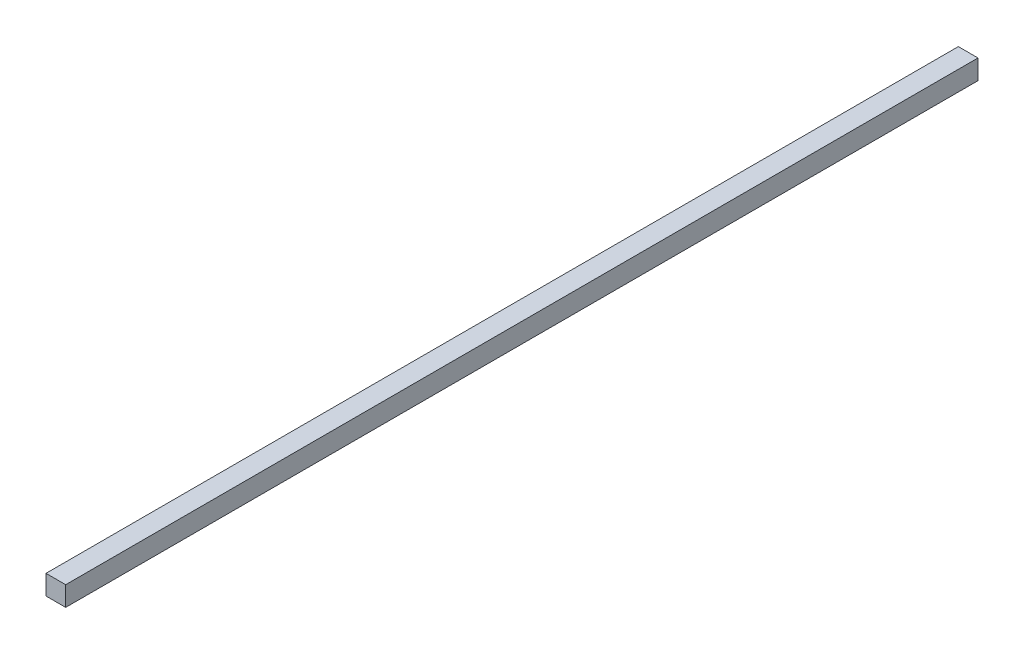
ISO-10303-21;
HEADER;
FILE_DESCRIPTION(('STEP AP214'),'2;1');
FILE_NAME('part.step','',(''),(''),'','','');
FILE_SCHEMA(('AUTOMOTIVE_DESIGN { 1 0 10303 214 1 1 1 1 }'));
ENDSEC;
DATA;
#1=APPLICATION_CONTEXT('core data for automotive mechanical design processes');
#2=APPLICATION_PROTOCOL_DEFINITION('international standard','automotive_design',2000,#1);
#3=PRODUCT_CONTEXT('',#1,'mechanical');
#4=PRODUCT('Part','Part','',(#3));
#5=PRODUCT_RELATED_PRODUCT_CATEGORY('part','',(#4));
#6=PRODUCT_DEFINITION_FORMATION('','',#4);
#7=PRODUCT_DEFINITION_CONTEXT('part definition',#1,'design');
#8=PRODUCT_DEFINITION('design','',#6,#7);
#9=PRODUCT_DEFINITION_SHAPE('','',#8);
#10=(LENGTH_UNIT() NAMED_UNIT(*) SI_UNIT(.MILLI.,.METRE.));
#11=(NAMED_UNIT(*) PLANE_ANGLE_UNIT() SI_UNIT($,.RADIAN.));
#12=(NAMED_UNIT(*) SI_UNIT($,.STERADIAN.) SOLID_ANGLE_UNIT());
#13=UNCERTAINTY_MEASURE_WITH_UNIT(LENGTH_MEASURE(1.E-05),#10,'distance_accuracy_value','');
#14=(GEOMETRIC_REPRESENTATION_CONTEXT(3) GLOBAL_UNCERTAINTY_ASSIGNED_CONTEXT((#13)) GLOBAL_UNIT_ASSIGNED_CONTEXT((#10,
#11,#12)) REPRESENTATION_CONTEXT('',''));
#15=CARTESIAN_POINT('',(0.,0.,0.));
#16=DIRECTION('',(0.,0.,1.));
#17=DIRECTION('',(1.,0.,0.));
#18=AXIS2_PLACEMENT_3D('',#15,#16,#17);
#19=CARTESIAN_POINT('',(0.,4.8,222.5));
#20=DIRECTION('',(1.,0.,0.));
#21=DIRECTION('',(0.,1.,0.));
#22=AXIS2_PLACEMENT_3D('',#19,#20,#21);
#23=PLANE('',#22);
#24=DIRECTION('',(0.,-1.,0.));
#25=VECTOR('',#24,1.);
#26=CARTESIAN_POINT('',(0.,4.8,0.));
#27=LINE('',#26,#25);
#28=CARTESIAN_POINT('',(0.,4.8,0.));
#29=VERTEX_POINT('',#28);
#30=CARTESIAN_POINT('',(0.,0.,0.));
#31=VERTEX_POINT('',#30);
#32=EDGE_CURVE('E96',#29,#31,#27,.T.);
#33=ORIENTED_EDGE('',*,*,#32,.T.);
#34=DIRECTION('',(0.,0.,-1.));
#35=VECTOR('',#34,1.);
#36=CARTESIAN_POINT('',(0.,0.,222.5));
#37=LINE('',#36,#35);
#38=CARTESIAN_POINT('',(0.,0.,222.5));
#39=VERTEX_POINT('',#38);
#40=EDGE_CURVE('E11',#39,#31,#37,.T.);
#41=ORIENTED_EDGE('',*,*,#40,.F.);
#42=DIRECTION('',(0.,-1.,0.));
#43=VECTOR('',#42,1.);
#44=CARTESIAN_POINT('',(0.,4.8,222.5));
#45=LINE('',#44,#43);
#46=CARTESIAN_POINT('',(0.,4.8,222.5));
#47=VERTEX_POINT('',#46);
#48=EDGE_CURVE('E84',#47,#39,#45,.T.);
#49=ORIENTED_EDGE('',*,*,#48,.F.);
#50=DIRECTION('',(0.,0.,-1.));
#51=VECTOR('',#50,1.);
#52=CARTESIAN_POINT('',(0.,4.8,222.5));
#53=LINE('',#52,#51);
#54=EDGE_CURVE('E92',#47,#29,#53,.T.);
#55=ORIENTED_EDGE('',*,*,#54,.T.);
#56=EDGE_LOOP('',(#33,#41,#49,#55));
#57=FACE_BOUND('',#56,.T.);
#58=ADVANCED_FACE('F33',(#57),#23,.F.);
#59=CARTESIAN_POINT('',(0.,0.,222.5));
#60=DIRECTION('',(0.,1.,0.));
#61=DIRECTION('',(0.,0.,1.));
#62=AXIS2_PLACEMENT_3D('',#59,#60,#61);
#63=PLANE('',#62);
#64=DIRECTION('',(1.,0.,0.));
#65=VECTOR('',#64,1.);
#66=CARTESIAN_POINT('',(0.,0.,0.));
#67=LINE('',#66,#65);
#68=CARTESIAN_POINT('',(4.8,0.,0.));
#69=VERTEX_POINT('',#68);
#70=EDGE_CURVE('E88',#31,#69,#67,.T.);
#71=ORIENTED_EDGE('',*,*,#70,.T.);
#72=DIRECTION('',(0.,0.,-1.));
#73=VECTOR('',#72,1.);
#74=CARTESIAN_POINT('',(4.8,0.,222.5));
#75=LINE('',#74,#73);
#76=CARTESIAN_POINT('',(4.8,0.,222.5));
#77=VERTEX_POINT('',#76);
#78=EDGE_CURVE('E41',#77,#69,#75,.T.);
#79=ORIENTED_EDGE('',*,*,#78,.F.);
#80=DIRECTION('',(1.,0.,0.));
#81=VECTOR('',#80,1.);
#82=CARTESIAN_POINT('',(0.,0.,222.5));
#83=LINE('',#82,#81);
#84=EDGE_CURVE('E79',#39,#77,#83,.T.);
#85=ORIENTED_EDGE('',*,*,#84,.F.);
#86=ORIENTED_EDGE('',*,*,#40,.T.);
#87=EDGE_LOOP('',(#71,#79,#85,#86));
#88=FACE_BOUND('',#87,.T.);
#89=ADVANCED_FACE('F87',(#88),#63,.F.);
#90=CARTESIAN_POINT('',(4.8,4.8,222.5));
#91=DIRECTION('',(-1.,0.,0.));
#92=DIRECTION('',(0.,0.,1.));
#93=AXIS2_PLACEMENT_3D('',#90,#91,#92);
#94=PLANE('',#93);
#95=DIRECTION('',(0.,1.,0.));
#96=VECTOR('',#95,1.);
#97=CARTESIAN_POINT('',(4.8,4.8,0.));
#98=LINE('',#97,#96);
#99=CARTESIAN_POINT('',(4.8,4.8,0.));
#100=VERTEX_POINT('',#99);
#101=EDGE_CURVE('E66',#69,#100,#98,.T.);
#102=ORIENTED_EDGE('',*,*,#101,.T.);
#103=DIRECTION('',(0.,0.,-1.));
#104=VECTOR('',#103,1.);
#105=CARTESIAN_POINT('',(4.8,4.8,222.5));
#106=LINE('',#105,#104);
#107=CARTESIAN_POINT('',(4.8,4.8,222.5));
#108=VERTEX_POINT('',#107);
#109=EDGE_CURVE('E89',#108,#100,#106,.T.);
#110=ORIENTED_EDGE('',*,*,#109,.F.);
#111=DIRECTION('',(0.,1.,0.));
#112=VECTOR('',#111,1.);
#113=CARTESIAN_POINT('',(4.8,4.8,222.5));
#114=LINE('',#113,#112);
#115=EDGE_CURVE('E82',#77,#108,#114,.T.);
#116=ORIENTED_EDGE('',*,*,#115,.F.);
#117=ORIENTED_EDGE('',*,*,#78,.T.);
#118=EDGE_LOOP('',(#102,#110,#116,#117));
#119=FACE_BOUND('',#118,.T.);
#120=ADVANCED_FACE('F90',(#119),#94,.F.);
#121=CARTESIAN_POINT('',(0.,4.8,222.5));
#122=DIRECTION('',(0.,-1.,0.));
#123=DIRECTION('',(1.,0.,0.));
#124=AXIS2_PLACEMENT_3D('',#121,#122,#123);
#125=PLANE('',#124);
#126=DIRECTION('',(-1.,0.,0.));
#127=VECTOR('',#126,1.);
#128=CARTESIAN_POINT('',(0.,4.8,0.));
#129=LINE('',#128,#127);
#130=EDGE_CURVE('E72',#100,#29,#129,.T.);
#131=ORIENTED_EDGE('',*,*,#130,.T.);
#132=ORIENTED_EDGE('',*,*,#54,.F.);
#133=DIRECTION('',(-1.,0.,0.));
#134=VECTOR('',#133,1.);
#135=CARTESIAN_POINT('',(0.,4.8,222.5));
#136=LINE('',#135,#134);
#137=EDGE_CURVE('E49',#108,#47,#136,.T.);
#138=ORIENTED_EDGE('',*,*,#137,.F.);
#139=ORIENTED_EDGE('',*,*,#109,.T.);
#140=EDGE_LOOP('',(#131,#132,#138,#139));
#141=FACE_BOUND('',#140,.T.);
#142=ADVANCED_FACE('F103',(#141),#125,.F.);
#143=CARTESIAN_POINT('',(0.,0.,222.5));
#144=DIRECTION('',(0.,0.,1.));
#145=DIRECTION('',(1.,0.,0.));
#146=AXIS2_PLACEMENT_3D('',#143,#144,#145);
#147=PLANE('',#146);
#148=ORIENTED_EDGE('',*,*,#48,.T.);
#149=ORIENTED_EDGE('',*,*,#84,.T.);
#150=ORIENTED_EDGE('',*,*,#115,.T.);
#151=ORIENTED_EDGE('',*,*,#137,.T.);
#152=EDGE_LOOP('',(#148,#149,#150,#151));
#153=FACE_BOUND('',#152,.T.);
#154=ADVANCED_FACE('F80',(#153),#147,.T.);
#155=CARTESIAN_POINT('',(0.,0.,0.));
#156=DIRECTION('',(0.,0.,1.));
#157=DIRECTION('',(1.,0.,0.));
#158=AXIS2_PLACEMENT_3D('',#155,#156,#157);
#159=PLANE('',#158);
#160=ORIENTED_EDGE('',*,*,#32,.F.);
#161=ORIENTED_EDGE('',*,*,#130,.F.);
#162=ORIENTED_EDGE('',*,*,#101,.F.);
#163=ORIENTED_EDGE('',*,*,#70,.F.);
#164=EDGE_LOOP('',(#160,#161,#162,#163));
#165=FACE_BOUND('',#164,.T.);
#166=ADVANCED_FACE('F106',(#165),#159,.F.);
#167=CLOSED_SHELL('',(#58,#89,#120,#142,#154,#166));
#168=MANIFOLD_SOLID_BREP('B2',#167);
#169=ADVANCED_BREP_SHAPE_REPRESENTATION('',(#18,#168),#14);
#170=SHAPE_DEFINITION_REPRESENTATION(#9,#169);
ENDSEC;
END-ISO-10303-21;
